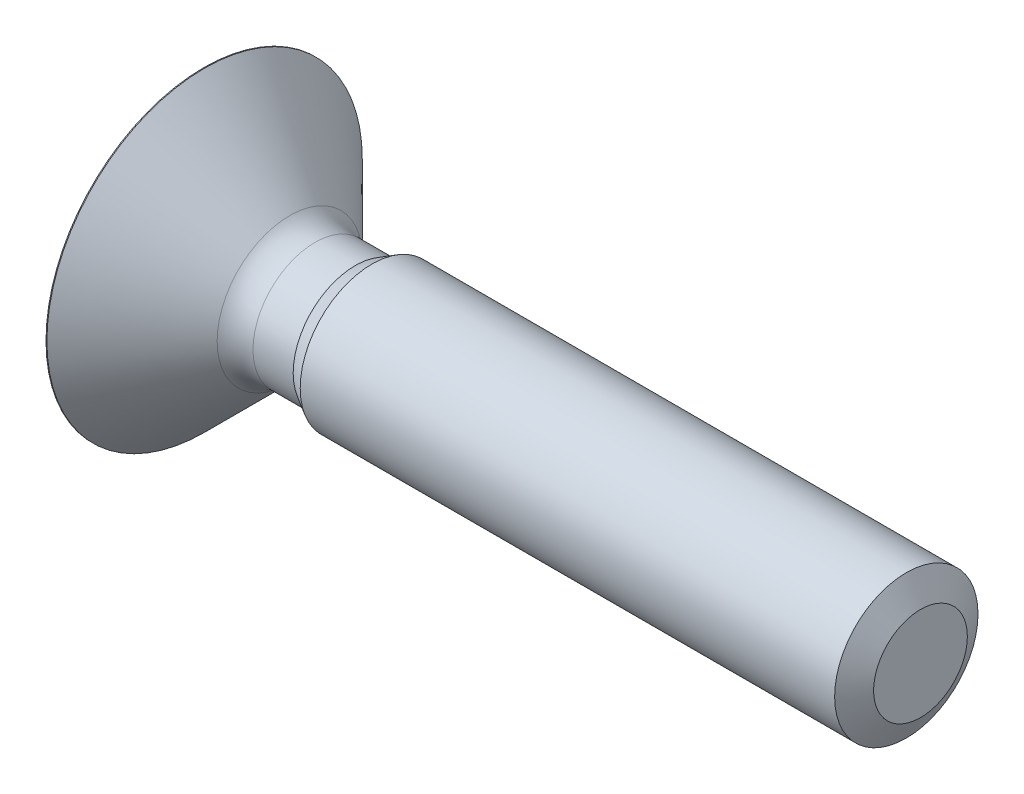
ISO-10303-21;
HEADER;
FILE_DESCRIPTION(('STEP AP214'),'2;1');
FILE_NAME('part.step','',(''),(''),'','','');
FILE_SCHEMA(('AUTOMOTIVE_DESIGN { 1 0 10303 214 1 1 1 1 }'));
ENDSEC;
DATA;
#1=APPLICATION_CONTEXT('core data for automotive mechanical design processes');
#2=APPLICATION_PROTOCOL_DEFINITION('international standard','automotive_design',2000,#1);
#3=PRODUCT_CONTEXT('',#1,'mechanical');
#4=PRODUCT('Part','Part','',(#3));
#5=PRODUCT_RELATED_PRODUCT_CATEGORY('part','',(#4));
#6=PRODUCT_DEFINITION_FORMATION('','',#4);
#7=PRODUCT_DEFINITION_CONTEXT('part definition',#1,'design');
#8=PRODUCT_DEFINITION('design','',#6,#7);
#9=PRODUCT_DEFINITION_SHAPE('','',#8);
#10=(LENGTH_UNIT() NAMED_UNIT(*) SI_UNIT(.MILLI.,.METRE.));
#11=(NAMED_UNIT(*) PLANE_ANGLE_UNIT() SI_UNIT($,.RADIAN.));
#12=(NAMED_UNIT(*) SI_UNIT($,.STERADIAN.) SOLID_ANGLE_UNIT());
#13=UNCERTAINTY_MEASURE_WITH_UNIT(LENGTH_MEASURE(1.E-05),#10,'distance_accuracy_value','');
#14=(GEOMETRIC_REPRESENTATION_CONTEXT(3) GLOBAL_UNCERTAINTY_ASSIGNED_CONTEXT((#13)) GLOBAL_UNIT_ASSIGNED_CONTEXT((#10,
#11,#12)) REPRESENTATION_CONTEXT('',''));
#15=CARTESIAN_POINT('',(0.,0.,0.));
#16=DIRECTION('',(0.,0.,1.));
#17=DIRECTION('',(1.,0.,0.));
#18=AXIS2_PLACEMENT_3D('',#15,#16,#17);
#19=CARTESIAN_POINT('',(0.,0.,0.));
#20=DIRECTION('',(1.,0.,0.));
#21=DIRECTION('',(0.,0.,-1.));
#22=AXIS2_PLACEMENT_3D('',#19,#20,#21);
#23=PLANE('',#22);
#24=CARTESIAN_POINT('',(0.,0.,0.));
#25=DIRECTION('',(-1.,0.,0.));
#26=DIRECTION('',(0.,0.,1.));
#27=AXIS2_PLACEMENT_3D('',#24,#25,#26);
#28=CIRCLE('',#27,2.2);
#29=CARTESIAN_POINT('',(0.,0.,2.2));
#30=VERTEX_POINT('',#29);
#31=EDGE_CURVE('E180',#30,#30,#28,.T.);
#32=ORIENTED_EDGE('',*,*,#31,.T.);
#33=EDGE_LOOP('',(#32));
#34=FACE_BOUND('',#33,.T.);
#35=DIRECTION('',(0.,1.,0.));
#36=VECTOR('',#35,1.);
#37=CARTESIAN_POINT('',(0.,1.1,0.200000000000004));
#38=LINE('',#37,#36);
#39=CARTESIAN_POINT('',(0.,0.2,0.200000000000001));
#40=VERTEX_POINT('',#39);
#41=CARTESIAN_POINT('',(0.,1.1,0.200000000000004));
#42=VERTEX_POINT('',#41);
#43=EDGE_CURVE('E103',#40,#42,#38,.T.);
#44=ORIENTED_EDGE('',*,*,#43,.F.);
#45=DIRECTION('',(0.,0.,-1.));
#46=VECTOR('',#45,1.);
#47=CARTESIAN_POINT('',(0.,0.2,-1.1));
#48=LINE('',#47,#46);
#49=CARTESIAN_POINT('',(0.,0.2,1.1));
#50=VERTEX_POINT('',#49);
#51=EDGE_CURVE('E148',#50,#40,#48,.T.);
#52=ORIENTED_EDGE('',*,*,#51,.F.);
#53=DIRECTION('',(0.,1.,0.));
#54=VECTOR('',#53,1.);
#55=CARTESIAN_POINT('',(0.,0.2,1.1));
#56=LINE('',#55,#54);
#57=CARTESIAN_POINT('',(0.,-0.2,1.1));
#58=VERTEX_POINT('',#57);
#59=EDGE_CURVE('E145',#58,#50,#56,.T.);
#60=ORIENTED_EDGE('',*,*,#59,.F.);
#61=DIRECTION('',(0.,0.,1.));
#62=VECTOR('',#61,1.);
#63=CARTESIAN_POINT('',(0.,-0.2,-1.1));
#64=LINE('',#63,#62);
#65=CARTESIAN_POINT('',(0.,-0.2,0.199999999999999));
#66=VERTEX_POINT('',#65);
#67=EDGE_CURVE('E76',#66,#58,#64,.T.);
#68=ORIENTED_EDGE('',*,*,#67,.F.);
#69=CARTESIAN_POINT('',(0.,-1.1,0.199999999999996));
#70=VERTEX_POINT('',#69);
#71=EDGE_CURVE('E111',#70,#66,#38,.T.);
#72=ORIENTED_EDGE('',*,*,#71,.F.);
#73=DIRECTION('',(0.,0.,1.));
#74=VECTOR('',#73,1.);
#75=CARTESIAN_POINT('',(0.,-1.1,0.199999999999996));
#76=LINE('',#75,#74);
#77=CARTESIAN_POINT('',(0.,-1.1,-0.200000000000004));
#78=VERTEX_POINT('',#77);
#79=EDGE_CURVE('E112',#78,#70,#76,.T.);
#80=ORIENTED_EDGE('',*,*,#79,.F.);
#81=DIRECTION('',(0.,-1.,0.));
#82=VECTOR('',#81,1.);
#83=CARTESIAN_POINT('',(0.,1.1,-0.199999999999996));
#84=LINE('',#83,#82);
#85=CARTESIAN_POINT('',(0.,-0.2,-0.200000000000001));
#86=VERTEX_POINT('',#85);
#87=EDGE_CURVE('E125',#86,#78,#84,.T.);
#88=ORIENTED_EDGE('',*,*,#87,.F.);
#89=CARTESIAN_POINT('',(0.,-0.2,-1.1));
#90=VERTEX_POINT('',#89);
#91=EDGE_CURVE('E142',#90,#86,#64,.T.);
#92=ORIENTED_EDGE('',*,*,#91,.F.);
#93=DIRECTION('',(0.,-1.,0.));
#94=VECTOR('',#93,1.);
#95=CARTESIAN_POINT('',(0.,0.2,-1.1));
#96=LINE('',#95,#94);
#97=CARTESIAN_POINT('',(0.,0.2,-1.1));
#98=VERTEX_POINT('',#97);
#99=EDGE_CURVE('E53',#98,#90,#96,.T.);
#100=ORIENTED_EDGE('',*,*,#99,.F.);
#101=CARTESIAN_POINT('',(0.,0.2,-0.199999999999999));
#102=VERTEX_POINT('',#101);
#103=EDGE_CURVE('E151',#102,#98,#48,.T.);
#104=ORIENTED_EDGE('',*,*,#103,.F.);
#105=CARTESIAN_POINT('',(0.,1.1,-0.199999999999996));
#106=VERTEX_POINT('',#105);
#107=EDGE_CURVE('E124',#106,#102,#84,.T.);
#108=ORIENTED_EDGE('',*,*,#107,.F.);
#109=DIRECTION('',(0.,0.,-1.));
#110=VECTOR('',#109,1.);
#111=CARTESIAN_POINT('',(0.,1.1,0.200000000000004));
#112=LINE('',#111,#110);
#113=EDGE_CURVE('E117',#42,#106,#112,.T.);
#114=ORIENTED_EDGE('',*,*,#113,.F.);
#115=EDGE_LOOP('',(#44,#52,#60,#68,#72,#80,#88,#92,#100,#104,#108,#114));
#116=FACE_BOUND('',#115,.T.);
#117=ADVANCED_FACE('F39',(#34,#116),#23,.F.);
#118=CARTESIAN_POINT('',(1.2,0.,0.));
#119=DIRECTION('',(-0.164398987305357,-0.986393923832144,0.));
#120=DIRECTION('',(0.986393923832144,-0.164398987305357,0.));
#121=AXIS2_PLACEMENT_3D('',#118,#119,#120);
#122=PLANE('',#121);
#123=ORIENTED_EDGE('',*,*,#51,.T.);
#124=DIRECTION('',(0.973328526784575,-0.162221421130763,-0.162221421130763));
#125=VECTOR('',#124,1.);
#126=CARTESIAN_POINT('',(1.2,0.,0.));
#127=LINE('',#126,#125);
#128=CARTESIAN_POINT('',(1.2,0.,0.));
#129=VERTEX_POINT('',#128);
#130=EDGE_CURVE('E82',#40,#129,#127,.T.);
#131=ORIENTED_EDGE('',*,*,#130,.T.);
#132=DIRECTION('',(0.731652913019631,-0.121942152169938,-0.670681836934662));
#133=VECTOR('',#132,1.);
#134=CARTESIAN_POINT('',(0.,0.2,1.1));
#135=LINE('',#134,#133);
#136=EDGE_CURVE('E62',#50,#129,#135,.T.);
#137=ORIENTED_EDGE('',*,*,#136,.F.);
#138=EDGE_LOOP('',(#123,#131,#137));
#139=FACE_BOUND('',#138,.T.);
#140=ADVANCED_FACE('F197',(#139),#122,.T.);
#141=DIRECTION('',(0.731652913019631,-0.121942152169938,0.670681836934662));
#142=VECTOR('',#141,1.);
#143=CARTESIAN_POINT('',(0.,0.2,-1.1));
#144=LINE('',#143,#142);
#145=EDGE_CURVE('E147',#98,#129,#144,.T.);
#146=ORIENTED_EDGE('',*,*,#145,.T.);
#147=DIRECTION('',(-0.973328526784575,0.162221421130763,-0.162221421130762));
#148=VECTOR('',#147,1.);
#149=CARTESIAN_POINT('',(1.2,0.,0.));
#150=LINE('',#149,#148);
#151=EDGE_CURVE('E129',#129,#102,#150,.T.);
#152=ORIENTED_EDGE('',*,*,#151,.T.);
#153=ORIENTED_EDGE('',*,*,#103,.T.);
#154=EDGE_LOOP('',(#146,#152,#153));
#155=FACE_BOUND('',#154,.T.);
#156=ADVANCED_FACE('F191',(#155),#122,.T.);
#157=CARTESIAN_POINT('',(1.2,0.,0.));
#158=DIRECTION('',(-0.164398987305357,0.986393923832144,0.));
#159=DIRECTION('',(-0.986393923832144,-0.164398987305357,0.));
#160=AXIS2_PLACEMENT_3D('',#157,#158,#159);
#161=PLANE('',#160);
#162=DIRECTION('',(0.731652913019631,0.121942152169938,-0.670681836934662));
#163=VECTOR('',#162,1.);
#164=CARTESIAN_POINT('',(0.,-0.2,1.1));
#165=LINE('',#164,#163);
#166=EDGE_CURVE('E141',#58,#129,#165,.T.);
#167=ORIENTED_EDGE('',*,*,#166,.T.);
#168=DIRECTION('',(-0.973328526784575,-0.162221421130763,0.162221421130762));
#169=VECTOR('',#168,1.);
#170=CARTESIAN_POINT('',(1.2,0.,0.));
#171=LINE('',#170,#169);
#172=EDGE_CURVE('E11',#129,#66,#171,.T.);
#173=ORIENTED_EDGE('',*,*,#172,.T.);
#174=ORIENTED_EDGE('',*,*,#67,.T.);
#175=EDGE_LOOP('',(#167,#173,#174));
#176=FACE_BOUND('',#175,.T.);
#177=ADVANCED_FACE('F192',(#176),#161,.T.);
#178=ORIENTED_EDGE('',*,*,#91,.T.);
#179=DIRECTION('',(0.973328526784575,0.162221421130763,0.162221421130763));
#180=VECTOR('',#179,1.);
#181=CARTESIAN_POINT('',(1.2,0.,0.));
#182=LINE('',#181,#180);
#183=EDGE_CURVE('E46',#86,#129,#182,.T.);
#184=ORIENTED_EDGE('',*,*,#183,.T.);
#185=DIRECTION('',(0.731652913019631,0.121942152169938,0.670681836934662));
#186=VECTOR('',#185,1.);
#187=CARTESIAN_POINT('',(0.,-0.2,-1.1));
#188=LINE('',#187,#186);
#189=EDGE_CURVE('E156',#90,#129,#188,.T.);
#190=ORIENTED_EDGE('',*,*,#189,.F.);
#191=EDGE_LOOP('',(#178,#184,#190));
#192=FACE_BOUND('',#191,.T.);
#193=ADVANCED_FACE('F185',(#192),#161,.T.);
#194=CARTESIAN_POINT('',(0.,0.,0.));
#195=DIRECTION('',(-1.,0.,0.));
#196=DIRECTION('',(0.,0.,1.));
#197=AXIS2_PLACEMENT_3D('',#194,#195,#196);
#198=CYLINDRICAL_SURFACE('',#197,2.2);
#199=ORIENTED_EDGE('',*,*,#31,.F.);
#200=EDGE_LOOP('',(#199));
#201=FACE_BOUND('',#200,.T.);
#202=CARTESIAN_POINT('',(0.012446609406732,0.,0.));
#203=DIRECTION('',(-1.,0.,0.));
#204=DIRECTION('',(0.,0.,1.));
#205=AXIS2_PLACEMENT_3D('',#202,#203,#204);
#206=CIRCLE('',#205,2.2);
#207=CARTESIAN_POINT('',(0.012446609406732,0.,2.2));
#208=VERTEX_POINT('',#207);
#209=EDGE_CURVE('E176',#208,#208,#206,.T.);
#210=ORIENTED_EDGE('',*,*,#209,.T.);
#211=EDGE_LOOP('',(#210));
#212=FACE_BOUND('',#211,.T.);
#213=ADVANCED_FACE('F225',(#201,#212),#198,.T.);
#214=CARTESIAN_POINT('',(1.2,0.,0.));
#215=DIRECTION('',(-1.,0.,0.));
#216=DIRECTION('',(0.,0.,1.));
#217=AXIS2_PLACEMENT_3D('',#214,#215,#216);
#218=CONICAL_SURFACE('',#217,1.01244660940673,0.785398163397451);
#219=ORIENTED_EDGE('',*,*,#209,.F.);
#220=EDGE_LOOP('',(#219));
#221=FACE_BOUND('',#220,.T.);
#222=CARTESIAN_POINT('',(1.2,0.,0.));
#223=DIRECTION('',(-1.,0.,0.));
#224=DIRECTION('',(0.,0.,1.));
#225=AXIS2_PLACEMENT_3D('',#222,#223,#224);
#226=CIRCLE('',#225,1.01244660940673);
#227=CARTESIAN_POINT('',(1.2,0.,1.01244660940673));
#228=VERTEX_POINT('',#227);
#229=EDGE_CURVE('E173',#228,#228,#226,.T.);
#230=ORIENTED_EDGE('',*,*,#229,.T.);
#231=EDGE_LOOP('',(#230));
#232=FACE_BOUND('',#231,.T.);
#233=ADVANCED_FACE('F228',(#221,#232),#218,.T.);
#234=CARTESIAN_POINT('',(1.55355339059327,0.,0.));
#235=DIRECTION('',(-1.,0.,0.));
#236=DIRECTION('',(0.,0.,1.));
#237=AXIS2_PLACEMENT_3D('',#234,#235,#236);
#238=TOROIDAL_SURFACE('',#237,1.366,0.5);
#239=ORIENTED_EDGE('',*,*,#229,.F.);
#240=EDGE_LOOP('',(#239));
#241=FACE_BOUND('',#240,.T.);
#242=CARTESIAN_POINT('',(1.55355339059327,0.,0.));
#243=DIRECTION('',(-1.,0.,0.));
#244=DIRECTION('',(0.,0.,1.));
#245=AXIS2_PLACEMENT_3D('',#242,#243,#244);
#246=CIRCLE('',#245,0.866);
#247=CARTESIAN_POINT('',(1.55355339059327,0.,0.866));
#248=VERTEX_POINT('',#247);
#249=EDGE_CURVE('E170',#248,#248,#246,.T.);
#250=ORIENTED_EDGE('',*,*,#249,.T.);
#251=EDGE_LOOP('',(#250));
#252=FACE_BOUND('',#251,.T.);
#253=ADVANCED_FACE('F233',(#241,#252),#238,.F.);
#254=CARTESIAN_POINT('',(0.,0.,0.));
#255=DIRECTION('',(-1.,0.,0.));
#256=DIRECTION('',(0.,0.,1.));
#257=AXIS2_PLACEMENT_3D('',#254,#255,#256);
#258=CYLINDRICAL_SURFACE('',#257,0.866);
#259=ORIENTED_EDGE('',*,*,#249,.F.);
#260=EDGE_LOOP('',(#259));
#261=FACE_BOUND('',#260,.T.);
#262=CARTESIAN_POINT('',(2.1143518011925,0.,0.));
#263=DIRECTION('',(-1.,0.,0.));
#264=DIRECTION('',(0.,0.,1.));
#265=AXIS2_PLACEMENT_3D('',#262,#263,#264);
#266=CIRCLE('',#265,0.866);
#267=CARTESIAN_POINT('',(2.1143518011925,0.,0.866));
#268=VERTEX_POINT('',#267);
#269=EDGE_CURVE('E167',#268,#268,#266,.T.);
#270=ORIENTED_EDGE('',*,*,#269,.T.);
#271=EDGE_LOOP('',(#270));
#272=FACE_BOUND('',#271,.T.);
#273=ADVANCED_FACE('F239',(#261,#272),#258,.T.);
#274=CARTESIAN_POINT('',(2.34644660940673,0.,0.));
#275=DIRECTION('',(1.,0.,0.));
#276=DIRECTION('',(0.,0.,-1.));
#277=AXIS2_PLACEMENT_3D('',#274,#275,#276);
#278=CONICAL_SURFACE('',#277,1.,0.5235987755983);
#279=ORIENTED_EDGE('',*,*,#269,.F.);
#280=EDGE_LOOP('',(#279));
#281=FACE_BOUND('',#280,.T.);
#282=CARTESIAN_POINT('',(2.34644660940673,0.,0.));
#283=DIRECTION('',(-1.,0.,0.));
#284=DIRECTION('',(0.,0.,1.));
#285=AXIS2_PLACEMENT_3D('',#282,#283,#284);
#286=CIRCLE('',#285,1.);
#287=CARTESIAN_POINT('',(2.34644660940673,0.,1.));
#288=VERTEX_POINT('',#287);
#289=EDGE_CURVE('E164',#288,#288,#286,.T.);
#290=ORIENTED_EDGE('',*,*,#289,.T.);
#291=EDGE_LOOP('',(#290));
#292=FACE_BOUND('',#291,.T.);
#293=ADVANCED_FACE('F245',(#281,#292),#278,.T.);
#294=CARTESIAN_POINT('',(0.,0.,0.));
#295=DIRECTION('',(-1.,0.,0.));
#296=DIRECTION('',(0.,0.,1.));
#297=AXIS2_PLACEMENT_3D('',#294,#295,#296);
#298=CYLINDRICAL_SURFACE('',#297,1.);
#299=CARTESIAN_POINT('',(9.802166402297,0.,0.));
#300=DIRECTION('',(1.,0.,0.));
#301=DIRECTION('',(0.,0.,-1.));
#302=AXIS2_PLACEMENT_3D('',#299,#300,#301);
#303=CIRCLE('',#302,1.);
#304=CARTESIAN_POINT('',(9.802166402297,0.,-1.));
#305=VERTEX_POINT('',#304);
#306=EDGE_CURVE('E161',#305,#305,#303,.T.);
#307=ORIENTED_EDGE('',*,*,#306,.F.);
#308=EDGE_LOOP('',(#307));
#309=FACE_BOUND('',#308,.T.);
#310=ORIENTED_EDGE('',*,*,#289,.F.);
#311=EDGE_LOOP('',(#310));
#312=FACE_BOUND('',#311,.T.);
#313=ADVANCED_FACE('F251',(#309,#312),#298,.T.);
#314=CARTESIAN_POINT('',(9.802166402297,0.,0.));
#315=DIRECTION('',(-1.,0.,0.));
#316=DIRECTION('',(0.,0.,1.));
#317=AXIS2_PLACEMENT_3D('',#314,#315,#316);
#318=CONICAL_SURFACE('',#317,1.,1.05188801855137);
#319=CARTESIAN_POINT('',(10.,0.,0.));
#320=DIRECTION('',(1.,0.,0.));
#321=DIRECTION('',(0.,0.,-1.));
#322=AXIS2_PLACEMENT_3D('',#319,#320,#321);
#323=CIRCLE('',#322,0.6536);
#324=CARTESIAN_POINT('',(10.,0.,-0.6536));
#325=VERTEX_POINT('',#324);
#326=EDGE_CURVE('E150',#325,#325,#323,.T.);
#327=ORIENTED_EDGE('',*,*,#326,.F.);
#328=EDGE_LOOP('',(#327));
#329=FACE_BOUND('',#328,.T.);
#330=ORIENTED_EDGE('',*,*,#306,.T.);
#331=EDGE_LOOP('',(#330));
#332=FACE_BOUND('',#331,.T.);
#333=ADVANCED_FACE('F256',(#329,#332),#318,.T.);
#334=CARTESIAN_POINT('',(10.,1.,0.));
#335=DIRECTION('',(-1.,0.,0.));
#336=DIRECTION('',(0.,0.,1.));
#337=AXIS2_PLACEMENT_3D('',#334,#335,#336);
#338=PLANE('',#337);
#339=ORIENTED_EDGE('',*,*,#326,.T.);
#340=EDGE_LOOP('',(#339));
#341=FACE_BOUND('',#340,.T.);
#342=ADVANCED_FACE('F262',(#341),#338,.F.);
#343=CARTESIAN_POINT('',(0.,0.2,-1.1));
#344=DIRECTION('',(0.675724628517346,0.,-0.737154140200741));
#345=DIRECTION('',(-0.737154140200741,0.,-0.675724628517346));
#346=AXIS2_PLACEMENT_3D('',#343,#344,#345);
#347=PLANE('',#346);
#348=ORIENTED_EDGE('',*,*,#145,.F.);
#349=ORIENTED_EDGE('',*,*,#99,.T.);
#350=ORIENTED_EDGE('',*,*,#189,.T.);
#351=EDGE_LOOP('',(#348,#349,#350));
#352=FACE_BOUND('',#351,.T.);
#353=ADVANCED_FACE('F189',(#352),#347,.F.);
#354=CARTESIAN_POINT('',(0.,-0.2,1.1));
#355=DIRECTION('',(0.675724628517346,0.,0.737154140200741));
#356=DIRECTION('',(0.737154140200741,0.,-0.675724628517346));
#357=AXIS2_PLACEMENT_3D('',#354,#355,#356);
#358=PLANE('',#357);
#359=ORIENTED_EDGE('',*,*,#166,.F.);
#360=ORIENTED_EDGE('',*,*,#59,.T.);
#361=ORIENTED_EDGE('',*,*,#136,.T.);
#362=EDGE_LOOP('',(#359,#360,#361));
#363=FACE_BOUND('',#362,.T.);
#364=ADVANCED_FACE('F196',(#363),#358,.F.);
#365=CARTESIAN_POINT('',(1.2,0.,0.));
#366=DIRECTION('',(-0.164398987305357,0.,-0.986393923832144));
#367=DIRECTION('',(0.986393923832144,0.,-0.164398987305357));
#368=AXIS2_PLACEMENT_3D('',#365,#366,#367);
#369=PLANE('',#368);
#370=DIRECTION('',(0.731652913019631,0.670681836934662,-0.121942152169936));
#371=VECTOR('',#370,1.);
#372=CARTESIAN_POINT('',(0.,-1.1,0.199999999999996));
#373=LINE('',#372,#371);
#374=EDGE_CURVE('E121',#70,#129,#373,.T.);
#375=ORIENTED_EDGE('',*,*,#374,.F.);
#376=ORIENTED_EDGE('',*,*,#71,.T.);
#377=ORIENTED_EDGE('',*,*,#172,.F.);
#378=EDGE_LOOP('',(#375,#376,#377));
#379=FACE_BOUND('',#378,.T.);
#380=ADVANCED_FACE('F201',(#379),#369,.T.);
#381=CARTESIAN_POINT('',(1.2,0.,0.));
#382=DIRECTION('',(-0.164398987305357,0.,0.986393923832144));
#383=DIRECTION('',(-0.986393923832144,0.,-0.164398987305357));
#384=AXIS2_PLACEMENT_3D('',#381,#382,#383);
#385=PLANE('',#384);
#386=ORIENTED_EDGE('',*,*,#87,.T.);
#387=DIRECTION('',(0.731652913019631,0.670681836934661,0.121942152169941));
#388=VECTOR('',#387,1.);
#389=CARTESIAN_POINT('',(0.,-1.1,-0.200000000000004));
#390=LINE('',#389,#388);
#391=EDGE_CURVE('E135',#78,#129,#390,.T.);
#392=ORIENTED_EDGE('',*,*,#391,.T.);
#393=ORIENTED_EDGE('',*,*,#183,.F.);
#394=EDGE_LOOP('',(#386,#392,#393));
#395=FACE_BOUND('',#394,.T.);
#396=ADVANCED_FACE('F205',(#395),#385,.T.);
#397=CARTESIAN_POINT('',(0.,-1.1,-0.200000000000004));
#398=DIRECTION('',(0.675724628517346,-0.737154140200741,0.));
#399=DIRECTION('',(0.737154140200741,0.675724628517346,0.));
#400=AXIS2_PLACEMENT_3D('',#397,#398,#399);
#401=PLANE('',#400);
#402=ORIENTED_EDGE('',*,*,#391,.F.);
#403=ORIENTED_EDGE('',*,*,#79,.T.);
#404=ORIENTED_EDGE('',*,*,#374,.T.);
#405=EDGE_LOOP('',(#402,#403,#404));
#406=FACE_BOUND('',#405,.T.);
#407=ADVANCED_FACE('F204',(#406),#401,.F.);
#408=ORIENTED_EDGE('',*,*,#43,.T.);
#409=DIRECTION('',(0.731652913019631,-0.670681836934661,-0.121942152169941));
#410=VECTOR('',#409,1.);
#411=CARTESIAN_POINT('',(0.,1.1,0.200000000000004));
#412=LINE('',#411,#410);
#413=EDGE_CURVE('E106',#42,#129,#412,.T.);
#414=ORIENTED_EDGE('',*,*,#413,.T.);
#415=ORIENTED_EDGE('',*,*,#130,.F.);
#416=EDGE_LOOP('',(#408,#414,#415));
#417=FACE_BOUND('',#416,.T.);
#418=ADVANCED_FACE('F105',(#417),#369,.T.);
#419=DIRECTION('',(0.731652913019631,-0.670681836934662,0.121942152169936));
#420=VECTOR('',#419,1.);
#421=CARTESIAN_POINT('',(0.,1.1,-0.199999999999996));
#422=LINE('',#421,#420);
#423=EDGE_CURVE('E119',#106,#129,#422,.T.);
#424=ORIENTED_EDGE('',*,*,#423,.F.);
#425=ORIENTED_EDGE('',*,*,#107,.T.);
#426=ORIENTED_EDGE('',*,*,#151,.F.);
#427=EDGE_LOOP('',(#424,#425,#426));
#428=FACE_BOUND('',#427,.T.);
#429=ADVANCED_FACE('F208',(#428),#385,.T.);
#430=CARTESIAN_POINT('',(0.,1.1,0.200000000000004));
#431=DIRECTION('',(0.675724628517346,0.737154140200741,0.));
#432=DIRECTION('',(-0.737154140200741,0.675724628517346,0.));
#433=AXIS2_PLACEMENT_3D('',#430,#431,#432);
#434=PLANE('',#433);
#435=ORIENTED_EDGE('',*,*,#413,.F.);
#436=ORIENTED_EDGE('',*,*,#113,.T.);
#437=ORIENTED_EDGE('',*,*,#423,.T.);
#438=EDGE_LOOP('',(#435,#436,#437));
#439=FACE_BOUND('',#438,.T.);
#440=ADVANCED_FACE('F116',(#439),#434,.F.);
#441=CLOSED_SHELL('',(#117,#140,#156,#177,#193,#213,#233,#253,#273,#293,#313,#333,#342,#353,
#364,#380,#396,#407,#418,#429,#440));
#442=MANIFOLD_SOLID_BREP('B2',#441);
#443=ADVANCED_BREP_SHAPE_REPRESENTATION('',(#18,#442),#14);
#444=SHAPE_DEFINITION_REPRESENTATION(#9,#443);
ENDSEC;
END-ISO-10303-21;
